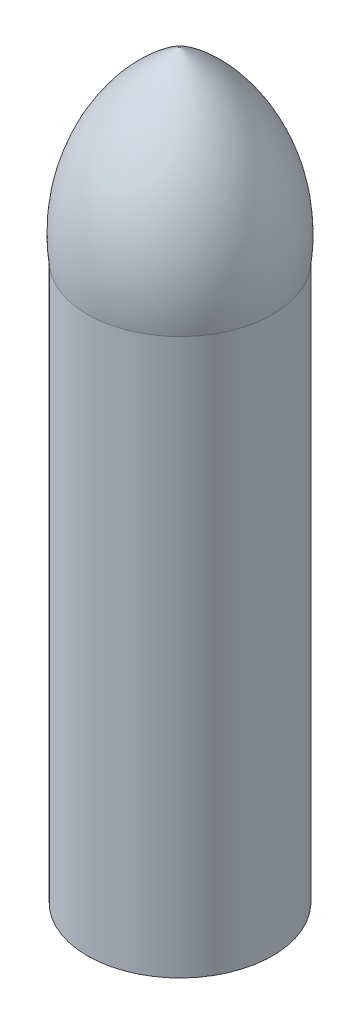
ISO-10303-21;
HEADER;
FILE_DESCRIPTION(('STEP AP214'),'2;1');
FILE_NAME('part.step','',(''),(''),'','','');
FILE_SCHEMA(('AUTOMOTIVE_DESIGN { 1 0 10303 214 1 1 1 1 }'));
ENDSEC;
DATA;
#1=APPLICATION_CONTEXT('core data for automotive mechanical design processes');
#2=APPLICATION_PROTOCOL_DEFINITION('international standard','automotive_design',2000,#1);
#3=PRODUCT_CONTEXT('',#1,'mechanical');
#4=PRODUCT('Part','Part','',(#3));
#5=PRODUCT_RELATED_PRODUCT_CATEGORY('part','',(#4));
#6=PRODUCT_DEFINITION_FORMATION('','',#4);
#7=PRODUCT_DEFINITION_CONTEXT('part definition',#1,'design');
#8=PRODUCT_DEFINITION('design','',#6,#7);
#9=PRODUCT_DEFINITION_SHAPE('','',#8);
#10=(LENGTH_UNIT() NAMED_UNIT(*) SI_UNIT(.MILLI.,.METRE.));
#11=(NAMED_UNIT(*) PLANE_ANGLE_UNIT() SI_UNIT($,.RADIAN.));
#12=(NAMED_UNIT(*) SI_UNIT($,.STERADIAN.) SOLID_ANGLE_UNIT());
#13=UNCERTAINTY_MEASURE_WITH_UNIT(LENGTH_MEASURE(1.E-05),#10,'distance_accuracy_value','');
#14=(GEOMETRIC_REPRESENTATION_CONTEXT(3) GLOBAL_UNCERTAINTY_ASSIGNED_CONTEXT((#13)) GLOBAL_UNIT_ASSIGNED_CONTEXT((#10,
#11,#12)) REPRESENTATION_CONTEXT('',''));
#15=CARTESIAN_POINT('',(0.,0.,0.));
#16=DIRECTION('',(0.,0.,1.));
#17=DIRECTION('',(1.,0.,0.));
#18=AXIS2_PLACEMENT_3D('',#15,#16,#17);
#19=CARTESIAN_POINT('',(0.,12.9190075645161,49.1619848709678));
#20=DIRECTION('',(-1.,0.,0.));
#21=DIRECTION('',(0.,0.,-1.));
#22=AXIS2_PLACEMENT_3D('',#19,#20,#21);
#23=CIRCLE('',#22,100.00000000001);
#24=TRIMMED_CURVE('',#23,(PARAMETER_VALUE(-1.05684738515036)),
(PARAMETER_VALUE(1.05684738515036)),.T.,.PARAMETER.);
#25=CARTESIAN_POINT('',(0.,12.9190075645161,0.));
#26=DIRECTION('',(0.,-1.,0.));
#27=AXIS1_PLACEMENT('',#25,#26);
#28=SURFACE_OF_REVOLUTION('',#24,#27);
#29=CARTESIAN_POINT('',(0.,0.,0.));
#30=DIRECTION('',(0.,-1.,0.));
#31=DIRECTION('',(0.,0.,-1.));
#32=AXIS2_PLACEMENT_3D('',#29,#30,#31);
#33=CIRCLE('',#32,50.);
#34=CARTESIAN_POINT('',(0.,0.,-50.));
#35=VERTEX_POINT('',#34);
#36=EDGE_CURVE('E11',#35,#35,#33,.T.);
#37=ORIENTED_EDGE('',*,*,#36,.F.);
#38=EDGE_LOOP('',(#37));
#39=FACE_BOUND('',#38,.T.);
#40=CARTESIAN_POINT('',(0.,100.,0.));
#41=VERTEX_POINT('',#40);
#42=VERTEX_LOOP('',#41);
#43=FACE_BOUND('',#42,.T.);
#44=ADVANCED_FACE('F41',(#39,#43),#28,.T.);
#45=CARTESIAN_POINT('',(0.,-300.,0.));
#46=DIRECTION('',(0.,1.,0.));
#47=DIRECTION('',(0.,0.,1.));
#48=AXIS2_PLACEMENT_3D('',#45,#46,#47);
#49=CYLINDRICAL_SURFACE('',#48,50.);
#50=CARTESIAN_POINT('',(0.,-300.,0.));
#51=DIRECTION('',(0.,-1.,0.));
#52=DIRECTION('',(0.,0.,-1.));
#53=AXIS2_PLACEMENT_3D('',#50,#51,#52);
#54=CIRCLE('',#53,50.);
#55=CARTESIAN_POINT('',(0.,-300.,-50.));
#56=VERTEX_POINT('',#55);
#57=EDGE_CURVE('E47',#56,#56,#54,.T.);
#58=ORIENTED_EDGE('',*,*,#57,.F.);
#59=EDGE_LOOP('',(#58));
#60=FACE_BOUND('',#59,.T.);
#61=ORIENTED_EDGE('',*,*,#36,.T.);
#62=EDGE_LOOP('',(#61));
#63=FACE_BOUND('',#62,.T.);
#64=ADVANCED_FACE('F51',(#60,#63),#49,.T.);
#65=CARTESIAN_POINT('',(0.,-300.,0.));
#66=DIRECTION('',(0.,-1.,0.));
#67=DIRECTION('',(0.,0.,-1.));
#68=AXIS2_PLACEMENT_3D('',#65,#66,#67);
#69=PLANE('',#68);
#70=ORIENTED_EDGE('',*,*,#57,.T.);
#71=EDGE_LOOP('',(#70));
#72=FACE_BOUND('',#71,.T.);
#73=ADVANCED_FACE('F56',(#72),#69,.T.);
#74=CLOSED_SHELL('',(#44,#64,#73));
#75=MANIFOLD_SOLID_BREP('B2',#74);
#76=ADVANCED_BREP_SHAPE_REPRESENTATION('',(#18,#75),#14);
#77=SHAPE_DEFINITION_REPRESENTATION(#9,#76);
ENDSEC;
END-ISO-10303-21;
